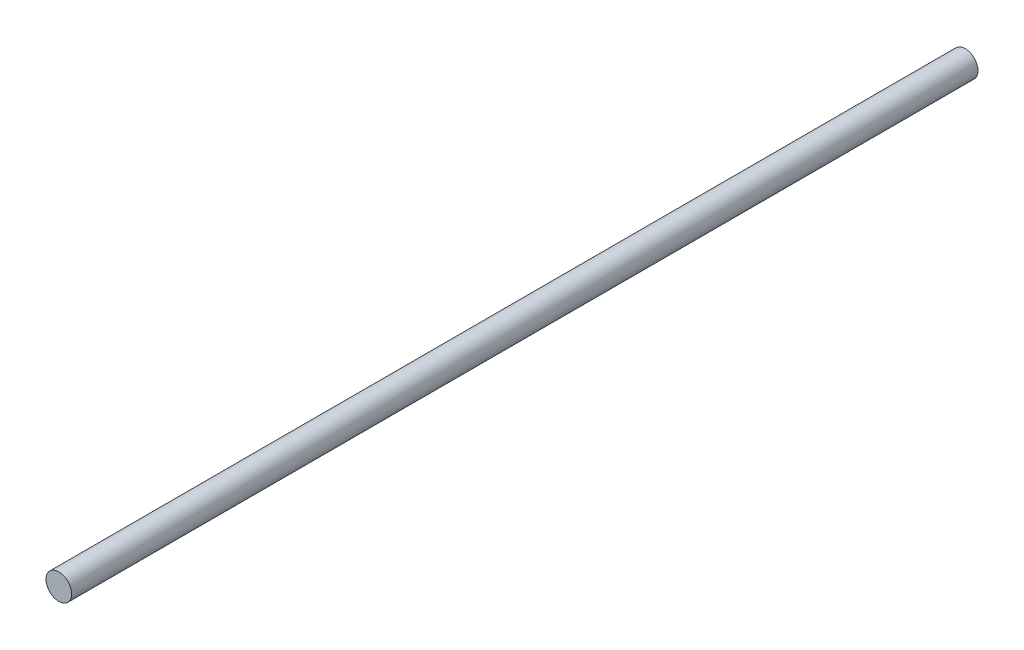
ISO-10303-21;
HEADER;
FILE_DESCRIPTION(('STEP AP214'),'2;1');
FILE_NAME('part.step','',(''),(''),'','','');
FILE_SCHEMA(('AUTOMOTIVE_DESIGN { 1 0 10303 214 1 1 1 1 }'));
ENDSEC;
DATA;
#1=APPLICATION_CONTEXT('core data for automotive mechanical design processes');
#2=APPLICATION_PROTOCOL_DEFINITION('international standard','automotive_design',2000,#1);
#3=PRODUCT_CONTEXT('',#1,'mechanical');
#4=PRODUCT('Part','Part','',(#3));
#5=PRODUCT_RELATED_PRODUCT_CATEGORY('part','',(#4));
#6=PRODUCT_DEFINITION_FORMATION('','',#4);
#7=PRODUCT_DEFINITION_CONTEXT('part definition',#1,'design');
#8=PRODUCT_DEFINITION('design','',#6,#7);
#9=PRODUCT_DEFINITION_SHAPE('','',#8);
#10=(LENGTH_UNIT() NAMED_UNIT(*) SI_UNIT(.MILLI.,.METRE.));
#11=(NAMED_UNIT(*) PLANE_ANGLE_UNIT() SI_UNIT($,.RADIAN.));
#12=(NAMED_UNIT(*) SI_UNIT($,.STERADIAN.) SOLID_ANGLE_UNIT());
#13=UNCERTAINTY_MEASURE_WITH_UNIT(LENGTH_MEASURE(1.E-05),#10,'distance_accuracy_value','');
#14=(GEOMETRIC_REPRESENTATION_CONTEXT(3) GLOBAL_UNCERTAINTY_ASSIGNED_CONTEXT((#13)) GLOBAL_UNIT_ASSIGNED_CONTEXT((#10,
#11,#12)) REPRESENTATION_CONTEXT('',''));
#15=CARTESIAN_POINT('',(0.,0.,0.));
#16=DIRECTION('',(0.,0.,1.));
#17=DIRECTION('',(1.,0.,0.));
#18=AXIS2_PLACEMENT_3D('',#15,#16,#17);
#19=CARTESIAN_POINT('',(0.,0.,53.));
#20=DIRECTION('',(0.,0.,-1.));
#21=DIRECTION('',(-1.,0.,0.));
#22=AXIS2_PLACEMENT_3D('',#19,#20,#21);
#23=CYLINDRICAL_SURFACE('',#22,0.75);
#24=CARTESIAN_POINT('',(0.,0.,53.));
#25=DIRECTION('',(0.,0.,1.));
#26=DIRECTION('',(1.,0.,0.));
#27=AXIS2_PLACEMENT_3D('',#24,#25,#26);
#28=CIRCLE('',#27,0.75);
#29=CARTESIAN_POINT('',(0.75,0.,53.));
#30=VERTEX_POINT('',#29);
#31=EDGE_CURVE('E10',#30,#30,#28,.T.);
#32=ORIENTED_EDGE('',*,*,#31,.F.);
#33=EDGE_LOOP('',(#32));
#34=FACE_BOUND('',#33,.T.);
#35=CARTESIAN_POINT('',(0.,0.,0.));
#36=DIRECTION('',(0.,0.,1.));
#37=DIRECTION('',(1.,0.,0.));
#38=AXIS2_PLACEMENT_3D('',#35,#36,#37);
#39=CIRCLE('',#38,0.75);
#40=CARTESIAN_POINT('',(0.75,0.,0.));
#41=VERTEX_POINT('',#40);
#42=EDGE_CURVE('E38',#41,#41,#39,.T.);
#43=ORIENTED_EDGE('',*,*,#42,.T.);
#44=EDGE_LOOP('',(#43));
#45=FACE_BOUND('',#44,.T.);
#46=ADVANCED_FACE('F35',(#34,#45),#23,.T.);
#47=CARTESIAN_POINT('',(0.,0.,53.));
#48=DIRECTION('',(0.,0.,1.));
#49=DIRECTION('',(1.,0.,0.));
#50=AXIS2_PLACEMENT_3D('',#47,#48,#49);
#51=PLANE('',#50);
#52=ORIENTED_EDGE('',*,*,#31,.T.);
#53=EDGE_LOOP('',(#52));
#54=FACE_BOUND('',#53,.T.);
#55=ADVANCED_FACE('F50',(#54),#51,.T.);
#56=CARTESIAN_POINT('',(0.,0.,0.));
#57=DIRECTION('',(0.,0.,1.));
#58=DIRECTION('',(1.,0.,0.));
#59=AXIS2_PLACEMENT_3D('',#56,#57,#58);
#60=PLANE('',#59);
#61=ORIENTED_EDGE('',*,*,#42,.F.);
#62=EDGE_LOOP('',(#61));
#63=FACE_BOUND('',#62,.T.);
#64=ADVANCED_FACE('F48',(#63),#60,.F.);
#65=CLOSED_SHELL('',(#46,#55,#64));
#66=MANIFOLD_SOLID_BREP('B2',#65);
#67=ADVANCED_BREP_SHAPE_REPRESENTATION('',(#18,#66),#14);
#68=SHAPE_DEFINITION_REPRESENTATION(#9,#67);
ENDSEC;
END-ISO-10303-21;
